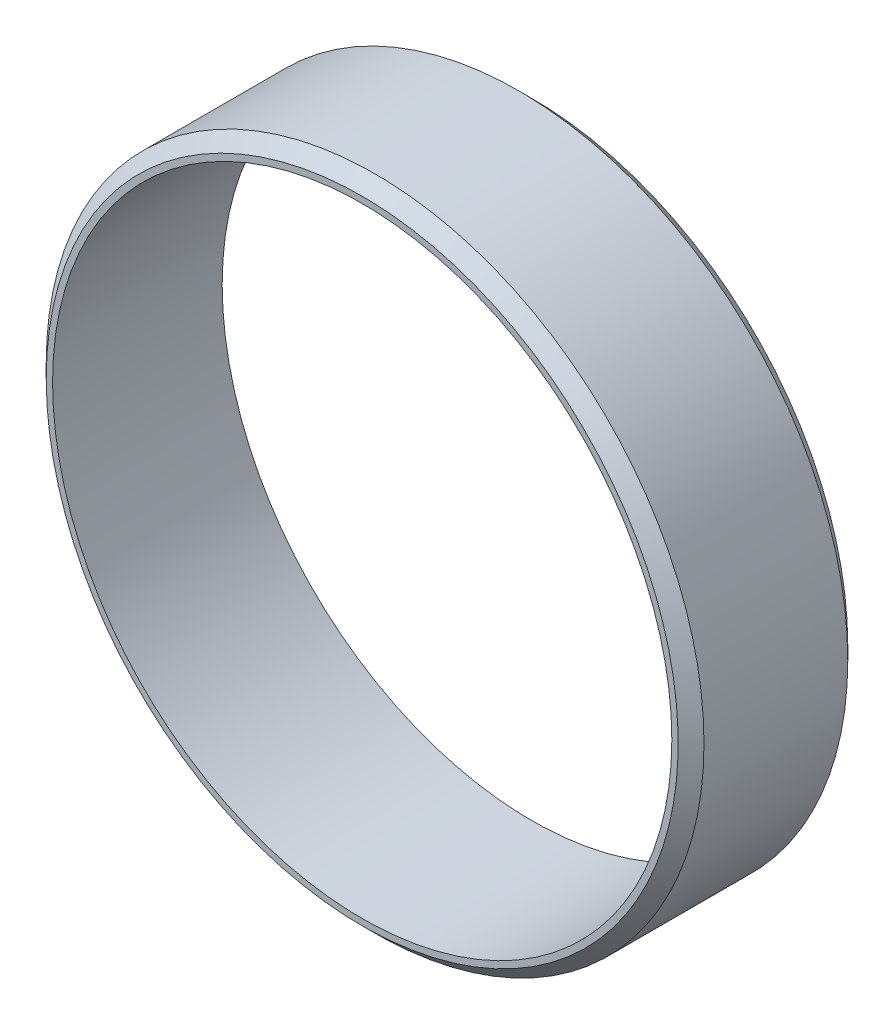
ISO-10303-21;
HEADER;
FILE_DESCRIPTION(('STEP AP214'),'2;1');
FILE_NAME('part.step','',(''),(''),'','','');
FILE_SCHEMA(('AUTOMOTIVE_DESIGN { 1 0 10303 214 1 1 1 1 }'));
ENDSEC;
DATA;
#1=APPLICATION_CONTEXT('core data for automotive mechanical design processes');
#2=APPLICATION_PROTOCOL_DEFINITION('international standard','automotive_design',2000,#1);
#3=PRODUCT_CONTEXT('',#1,'mechanical');
#4=PRODUCT('Part','Part','',(#3));
#5=PRODUCT_RELATED_PRODUCT_CATEGORY('part','',(#4));
#6=PRODUCT_DEFINITION_FORMATION('','',#4);
#7=PRODUCT_DEFINITION_CONTEXT('part definition',#1,'design');
#8=PRODUCT_DEFINITION('design','',#6,#7);
#9=PRODUCT_DEFINITION_SHAPE('','',#8);
#10=(LENGTH_UNIT() NAMED_UNIT(*) SI_UNIT(.MILLI.,.METRE.));
#11=(NAMED_UNIT(*) PLANE_ANGLE_UNIT() SI_UNIT($,.RADIAN.));
#12=(NAMED_UNIT(*) SI_UNIT($,.STERADIAN.) SOLID_ANGLE_UNIT());
#13=UNCERTAINTY_MEASURE_WITH_UNIT(LENGTH_MEASURE(1.E-05),#10,'distance_accuracy_value','');
#14=(GEOMETRIC_REPRESENTATION_CONTEXT(3) GLOBAL_UNCERTAINTY_ASSIGNED_CONTEXT((#13)) GLOBAL_UNIT_ASSIGNED_CONTEXT((#10,
#11,#12)) REPRESENTATION_CONTEXT('',''));
#15=CARTESIAN_POINT('',(0.,0.,0.));
#16=DIRECTION('',(0.,0.,1.));
#17=DIRECTION('',(1.,0.,0.));
#18=AXIS2_PLACEMENT_3D('',#15,#16,#17);
#19=CARTESIAN_POINT('',(0.,0.,-7.));
#20=DIRECTION('',(0.,0.,1.));
#21=DIRECTION('',(1.,0.,0.));
#22=AXIS2_PLACEMENT_3D('',#19,#20,#21);
#23=CYLINDRICAL_SURFACE('',#22,44.6);
#24=CARTESIAN_POINT('',(0.,0.,-5.24999999999998));
#25=DIRECTION('',(0.,0.,1.));
#26=DIRECTION('',(1.,0.,0.));
#27=AXIS2_PLACEMENT_3D('',#24,#25,#26);
#28=CIRCLE('',#27,44.6);
#29=CARTESIAN_POINT('',(44.6,0.,-5.24999999999998));
#30=VERTEX_POINT('',#29);
#31=EDGE_CURVE('E36',#30,#30,#28,.F.);
#32=ORIENTED_EDGE('',*,*,#31,.F.);
#33=EDGE_LOOP('',(#32));
#34=FACE_BOUND('',#33,.T.);
#35=CARTESIAN_POINT('',(0.,0.,14.25));
#36=DIRECTION('',(0.,0.,-1.));
#37=DIRECTION('',(-1.,0.,0.));
#38=AXIS2_PLACEMENT_3D('',#35,#36,#37);
#39=CIRCLE('',#38,44.6);
#40=CARTESIAN_POINT('',(-44.6,0.,14.25));
#41=VERTEX_POINT('',#40);
#42=EDGE_CURVE('E30',#41,#41,#39,.F.);
#43=ORIENTED_EDGE('',*,*,#42,.F.);
#44=EDGE_LOOP('',(#43));
#45=FACE_BOUND('',#44,.T.);
#46=ADVANCED_FACE('F15',(#34,#45),#23,.T.);
#47=CARTESIAN_POINT('',(0.,0.,14.25));
#48=DIRECTION('',(0.,0.,-1.));
#49=DIRECTION('',(-1.,0.,0.));
#50=AXIS2_PLACEMENT_3D('',#47,#48,#49);
#51=CONICAL_SURFACE('',#50,44.6,0.785398163397452);
#52=ORIENTED_EDGE('',*,*,#42,.T.);
#53=EDGE_LOOP('',(#52));
#54=FACE_BOUND('',#53,.T.);
#55=CARTESIAN_POINT('',(0.,0.,16.));
#56=DIRECTION('',(0.,0.,-1.));
#57=DIRECTION('',(-1.,0.,0.));
#58=AXIS2_PLACEMENT_3D('',#55,#56,#57);
#59=CIRCLE('',#58,42.85);
#60=CARTESIAN_POINT('',(-42.85,0.,16.));
#61=VERTEX_POINT('',#60);
#62=EDGE_CURVE('E18',#61,#61,#59,.F.);
#63=ORIENTED_EDGE('',*,*,#62,.F.);
#64=EDGE_LOOP('',(#63));
#65=FACE_BOUND('',#64,.T.);
#66=ADVANCED_FACE('F45',(#54,#65),#51,.T.);
#67=CARTESIAN_POINT('',(0.,0.,-5.24999999999998));
#68=DIRECTION('',(0.,0.,1.));
#69=DIRECTION('',(1.,0.,0.));
#70=AXIS2_PLACEMENT_3D('',#67,#68,#69);
#71=CONICAL_SURFACE('',#70,44.6,0.785398163397451);
#72=CARTESIAN_POINT('',(0.,0.,-7.));
#73=DIRECTION('',(0.,0.,1.));
#74=DIRECTION('',(1.,0.,0.));
#75=AXIS2_PLACEMENT_3D('',#72,#73,#74);
#76=CIRCLE('',#75,42.85);
#77=CARTESIAN_POINT('',(42.85,0.,-7.));
#78=VERTEX_POINT('',#77);
#79=EDGE_CURVE('E27',#78,#78,#76,.T.);
#80=ORIENTED_EDGE('',*,*,#79,.T.);
#81=EDGE_LOOP('',(#80));
#82=FACE_BOUND('',#81,.T.);
#83=ORIENTED_EDGE('',*,*,#31,.T.);
#84=EDGE_LOOP('',(#83));
#85=FACE_BOUND('',#84,.T.);
#86=ADVANCED_FACE('F54',(#82,#85),#71,.T.);
#87=CARTESIAN_POINT('',(0.,0.,16.));
#88=DIRECTION('',(0.,0.,1.));
#89=DIRECTION('',(1.,0.,0.));
#90=AXIS2_PLACEMENT_3D('',#87,#88,#89);
#91=PLANE('',#90);
#92=CARTESIAN_POINT('',(0.,0.,16.));
#93=DIRECTION('',(0.,0.,1.));
#94=DIRECTION('',(1.,0.,0.));
#95=AXIS2_PLACEMENT_3D('',#92,#93,#94);
#96=CIRCLE('',#95,41.99);
#97=CARTESIAN_POINT('',(41.99,0.,16.));
#98=VERTEX_POINT('',#97);
#99=EDGE_CURVE('E22',#98,#98,#96,.F.);
#100=ORIENTED_EDGE('',*,*,#99,.T.);
#101=EDGE_LOOP('',(#100));
#102=FACE_BOUND('',#101,.T.);
#103=ORIENTED_EDGE('',*,*,#62,.T.);
#104=EDGE_LOOP('',(#103));
#105=FACE_BOUND('',#104,.T.);
#106=ADVANCED_FACE('F63',(#102,#105),#91,.T.);
#107=CARTESIAN_POINT('',(0.,0.,-7.));
#108=DIRECTION('',(0.,0.,1.));
#109=DIRECTION('',(1.,0.,0.));
#110=AXIS2_PLACEMENT_3D('',#107,#108,#109);
#111=PLANE('',#110);
#112=CARTESIAN_POINT('',(0.,0.,-7.));
#113=DIRECTION('',(0.,0.,1.));
#114=DIRECTION('',(1.,0.,0.));
#115=AXIS2_PLACEMENT_3D('',#112,#113,#114);
#116=CIRCLE('',#115,41.99);
#117=CARTESIAN_POINT('',(41.99,0.,-7.));
#118=VERTEX_POINT('',#117);
#119=EDGE_CURVE('E10',#118,#118,#116,.T.);
#120=ORIENTED_EDGE('',*,*,#119,.T.);
#121=EDGE_LOOP('',(#120));
#122=FACE_BOUND('',#121,.T.);
#123=ORIENTED_EDGE('',*,*,#79,.F.);
#124=EDGE_LOOP('',(#123));
#125=FACE_BOUND('',#124,.T.);
#126=ADVANCED_FACE('F57',(#122,#125),#111,.F.);
#127=CARTESIAN_POINT('',(0.,0.,-7.));
#128=DIRECTION('',(0.,0.,1.));
#129=DIRECTION('',(1.,0.,0.));
#130=AXIS2_PLACEMENT_3D('',#127,#128,#129);
#131=CYLINDRICAL_SURFACE('',#130,41.99);
#132=ORIENTED_EDGE('',*,*,#99,.F.);
#133=EDGE_LOOP('',(#132));
#134=FACE_BOUND('',#133,.T.);
#135=ORIENTED_EDGE('',*,*,#119,.F.);
#136=EDGE_LOOP('',(#135));
#137=FACE_BOUND('',#136,.T.);
#138=ADVANCED_FACE('F55',(#134,#137),#131,.F.);
#139=CLOSED_SHELL('',(#46,#66,#86,#106,#126,#138));
#140=MANIFOLD_SOLID_BREP('B1',#139);
#141=ADVANCED_BREP_SHAPE_REPRESENTATION('',(#18,#140),#14);
#142=SHAPE_DEFINITION_REPRESENTATION(#9,#141);
ENDSEC;
END-ISO-10303-21;
